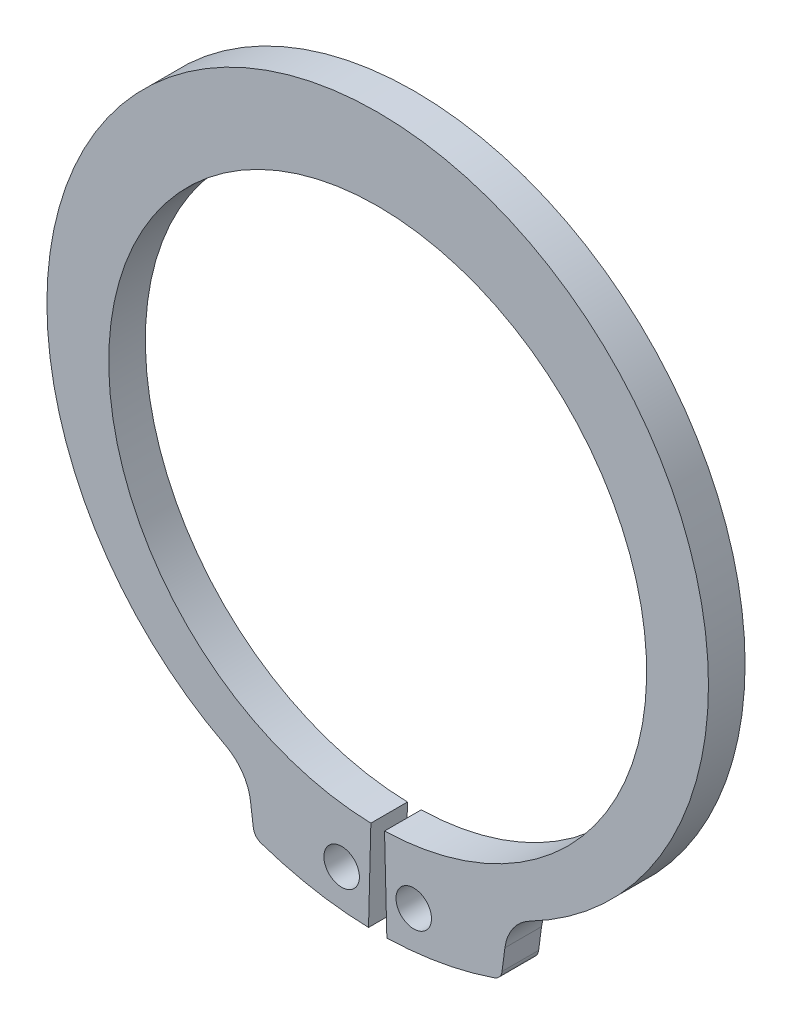
ISO-10303-21;
HEADER;
FILE_DESCRIPTION(('STEP AP214'),'2;1');
FILE_NAME('part.step','',(''),(''),'','','');
FILE_SCHEMA(('AUTOMOTIVE_DESIGN { 1 0 10303 214 1 1 1 1 }'));
ENDSEC;
DATA;
#1=APPLICATION_CONTEXT('core data for automotive mechanical design processes');
#2=APPLICATION_PROTOCOL_DEFINITION('international standard','automotive_design',2000,#1);
#3=PRODUCT_CONTEXT('',#1,'mechanical');
#4=PRODUCT('Part','Part','',(#3));
#5=PRODUCT_RELATED_PRODUCT_CATEGORY('part','',(#4));
#6=PRODUCT_DEFINITION_FORMATION('','',#4);
#7=PRODUCT_DEFINITION_CONTEXT('part definition',#1,'design');
#8=PRODUCT_DEFINITION('design','',#6,#7);
#9=PRODUCT_DEFINITION_SHAPE('','',#8);
#10=(LENGTH_UNIT() NAMED_UNIT(*) SI_UNIT(.MILLI.,.METRE.));
#11=(NAMED_UNIT(*) PLANE_ANGLE_UNIT() SI_UNIT($,.RADIAN.));
#12=(NAMED_UNIT(*) SI_UNIT($,.STERADIAN.) SOLID_ANGLE_UNIT());
#13=UNCERTAINTY_MEASURE_WITH_UNIT(LENGTH_MEASURE(1.E-05),#10,'distance_accuracy_value','');
#14=(GEOMETRIC_REPRESENTATION_CONTEXT(3) GLOBAL_UNCERTAINTY_ASSIGNED_CONTEXT((#13)) GLOBAL_UNIT_ASSIGNED_CONTEXT((#10,
#11,#12)) REPRESENTATION_CONTEXT('',''));
#15=CARTESIAN_POINT('',(0.,0.,0.));
#16=DIRECTION('',(0.,0.,1.));
#17=DIRECTION('',(1.,0.,0.));
#18=AXIS2_PLACEMENT_3D('',#15,#16,#17);
#19=CARTESIAN_POINT('',(0.,0.,-3.2));
#20=DIRECTION('',(0.,0.,1.));
#21=DIRECTION('',(1.,0.,0.));
#22=AXIS2_PLACEMENT_3D('',#19,#20,#21);
#23=CYLINDRICAL_SURFACE('',#22,23.5);
#24=CARTESIAN_POINT('',(0.,0.,0.));
#25=DIRECTION('',(0.,0.,-1.));
#26=DIRECTION('',(1.,0.,0.));
#27=AXIS2_PLACEMENT_3D('',#24,#25,#26);
#28=CIRCLE('',#27,23.5);
#29=CARTESIAN_POINT('',(-0.596825396825397,-23.4924200423393,0.));
#30=VERTEX_POINT('',#29);
#31=CARTESIAN_POINT('',(0.596825396825397,-23.4924200423393,0.));
#32=VERTEX_POINT('',#31);
#33=EDGE_CURVE('E155',#30,#32,#28,.T.);
#34=ORIENTED_EDGE('',*,*,#33,.F.);
#35=DIRECTION('',(0.,0.,1.));
#36=VECTOR('',#35,1.);
#37=CARTESIAN_POINT('',(-0.596825396825397,-23.4924200423393,-3.2));
#38=LINE('',#37,#36);
#39=CARTESIAN_POINT('',(-0.596825396825397,-23.4924200423393,-3.2));
#40=VERTEX_POINT('',#39);
#41=EDGE_CURVE('E11',#40,#30,#38,.T.);
#42=ORIENTED_EDGE('',*,*,#41,.F.);
#43=CARTESIAN_POINT('',(0.,0.,-3.2));
#44=DIRECTION('',(0.,0.,-1.));
#45=DIRECTION('',(1.,0.,0.));
#46=AXIS2_PLACEMENT_3D('',#43,#44,#45);
#47=CIRCLE('',#46,23.5);
#48=CARTESIAN_POINT('',(0.596825396825397,-23.4924200423393,-3.2));
#49=VERTEX_POINT('',#48);
#50=EDGE_CURVE('E188',#40,#49,#47,.T.);
#51=ORIENTED_EDGE('',*,*,#50,.T.);
#52=DIRECTION('',(0.,0.,1.));
#53=VECTOR('',#52,1.);
#54=CARTESIAN_POINT('',(0.596825396825397,-23.4924200423393,-3.2));
#55=LINE('',#54,#53);
#56=EDGE_CURVE('E37',#49,#32,#55,.T.);
#57=ORIENTED_EDGE('',*,*,#56,.T.);
#58=EDGE_LOOP('',(#34,#42,#51,#57));
#59=FACE_BOUND('',#58,.T.);
#60=ADVANCED_FACE('F34',(#59),#23,.F.);
#61=CARTESIAN_POINT('',(-0.596825396825397,-23.4924200423393,-3.2));
#62=DIRECTION('',(0.999677448610182,-0.0253968253968254,0.));
#63=DIRECTION('',(0.0253968253968254,0.999677448610182,0.));
#64=AXIS2_PLACEMENT_3D('',#61,#62,#63);
#65=PLANE('',#64);
#66=DIRECTION('',(0.0253968253968254,0.999677448610182,0.));
#67=VECTOR('',#66,1.);
#68=CARTESIAN_POINT('',(-0.596825396825397,-23.4924200423393,0.));
#69=LINE('',#68,#67);
#70=CARTESIAN_POINT('',(-0.8,-31.4898396312207,0.));
#71=VERTEX_POINT('',#70);
#72=EDGE_CURVE('E186',#71,#30,#69,.T.);
#73=ORIENTED_EDGE('',*,*,#72,.F.);
#74=DIRECTION('',(0.,0.,1.));
#75=VECTOR('',#74,1.);
#76=CARTESIAN_POINT('',(-0.8,-31.4898396312207,-3.2));
#77=LINE('',#76,#75);
#78=CARTESIAN_POINT('',(-0.8,-31.4898396312207,-3.2));
#79=VERTEX_POINT('',#78);
#80=EDGE_CURVE('E43',#79,#71,#77,.T.);
#81=ORIENTED_EDGE('',*,*,#80,.F.);
#82=DIRECTION('',(0.0253968253968254,0.999677448610182,0.));
#83=VECTOR('',#82,1.);
#84=CARTESIAN_POINT('',(-0.596825396825397,-23.4924200423393,-3.2));
#85=LINE('',#84,#83);
#86=EDGE_CURVE('E145',#79,#40,#85,.T.);
#87=ORIENTED_EDGE('',*,*,#86,.T.);
#88=ORIENTED_EDGE('',*,*,#41,.T.);
#89=EDGE_LOOP('',(#73,#81,#87,#88));
#90=FACE_BOUND('',#89,.T.);
#91=ADVANCED_FACE('F208',(#90),#65,.T.);
#92=CARTESIAN_POINT('',(0.,0.,-3.2));
#93=DIRECTION('',(0.,0.,1.));
#94=DIRECTION('',(1.,0.,0.));
#95=AXIS2_PLACEMENT_3D('',#92,#93,#94);
#96=CYLINDRICAL_SURFACE('',#95,31.5);
#97=CARTESIAN_POINT('',(0.,0.,0.));
#98=DIRECTION('',(0.,0.,1.));
#99=DIRECTION('',(1.,0.,0.));
#100=AXIS2_PLACEMENT_3D('',#97,#98,#99);
#101=CIRCLE('',#100,31.5);
#102=CARTESIAN_POINT('',(-10.1952854062747,-29.8044653614958,0.));
#103=VERTEX_POINT('',#102);
#104=EDGE_CURVE('E132',#103,#71,#101,.T.);
#105=ORIENTED_EDGE('',*,*,#104,.F.);
#106=DIRECTION('',(0.,0.,1.));
#107=VECTOR('',#106,1.);
#108=CARTESIAN_POINT('',(-10.1952854062747,-29.8044653614958,-3.2));
#109=LINE('',#108,#107);
#110=CARTESIAN_POINT('',(-10.1952854062747,-29.8044653614958,-3.2));
#111=VERTEX_POINT('',#110);
#112=EDGE_CURVE('E127',#111,#103,#109,.T.);
#113=ORIENTED_EDGE('',*,*,#112,.F.);
#114=CARTESIAN_POINT('',(0.,0.,-3.2));
#115=DIRECTION('',(0.,0.,1.));
#116=DIRECTION('',(1.,0.,0.));
#117=AXIS2_PLACEMENT_3D('',#114,#115,#116);
#118=CIRCLE('',#117,31.5);
#119=EDGE_CURVE('E130',#111,#79,#118,.T.);
#120=ORIENTED_EDGE('',*,*,#119,.T.);
#121=ORIENTED_EDGE('',*,*,#80,.T.);
#122=EDGE_LOOP('',(#105,#113,#120,#121));
#123=FACE_BOUND('',#122,.T.);
#124=ADVANCED_FACE('F129',(#123),#96,.T.);
#125=CARTESIAN_POINT('',(-9.87162555210725,-28.8582918579562,-3.2));
#126=DIRECTION('',(0.,0.,1.));
#127=DIRECTION('',(1.,0.,0.));
#128=AXIS2_PLACEMENT_3D('',#125,#126,#127);
#129=CYLINDRICAL_SURFACE('',#128,1.);
#130=CARTESIAN_POINT('',(-9.87162555210725,-28.8582918579562,0.));
#131=DIRECTION('',(0.,0.,1.));
#132=DIRECTION('',(1.,0.,0.));
#133=AXIS2_PLACEMENT_3D('',#130,#131,#132);
#134=CIRCLE('',#133,1.);
#135=CARTESIAN_POINT('',(-10.8630704134811,-28.9888180501763,0.));
#136=VERTEX_POINT('',#135);
#137=EDGE_CURVE('E183',#136,#103,#134,.T.);
#138=ORIENTED_EDGE('',*,*,#137,.F.);
#139=DIRECTION('',(0.,0.,1.));
#140=VECTOR('',#139,1.);
#141=CARTESIAN_POINT('',(-10.8630704134811,-28.9888180501763,-3.2));
#142=LINE('',#141,#140);
#143=CARTESIAN_POINT('',(-10.8630704134811,-28.9888180501763,-3.2));
#144=VERTEX_POINT('',#143);
#145=EDGE_CURVE('E137',#144,#136,#142,.T.);
#146=ORIENTED_EDGE('',*,*,#145,.F.);
#147=CARTESIAN_POINT('',(-9.87162555210725,-28.8582918579562,-3.2));
#148=DIRECTION('',(0.,0.,1.));
#149=DIRECTION('',(1.,0.,0.));
#150=AXIS2_PLACEMENT_3D('',#147,#148,#149);
#151=CIRCLE('',#150,1.);
#152=EDGE_CURVE('E143',#144,#111,#151,.T.);
#153=ORIENTED_EDGE('',*,*,#152,.T.);
#154=ORIENTED_EDGE('',*,*,#112,.T.);
#155=EDGE_LOOP('',(#138,#146,#153,#154));
#156=FACE_BOUND('',#155,.T.);
#157=ADVANCED_FACE('F147',(#156),#129,.T.);
#158=CARTESIAN_POINT('',(-11.1161809349621,-27.0662527656628,-3.2));
#159=DIRECTION('',(-0.99144486137381,-0.130526192220056,0.));
#160=DIRECTION('',(0.130526192220056,-0.99144486137381,0.));
#161=AXIS2_PLACEMENT_3D('',#158,#159,#160);
#162=PLANE('',#161);
#163=DIRECTION('',(0.130526192220056,-0.99144486137381,0.));
#164=VECTOR('',#163,1.);
#165=CARTESIAN_POINT('',(-11.1161809349621,-27.0662527656628,0.));
#166=LINE('',#165,#164);
#167=CARTESIAN_POINT('',(-11.1161809349621,-27.0662527656628,0.));
#168=VERTEX_POINT('',#167);
#169=EDGE_CURVE('E180',#168,#136,#166,.T.);
#170=ORIENTED_EDGE('',*,*,#169,.F.);
#171=DIRECTION('',(0.,0.,1.));
#172=VECTOR('',#171,1.);
#173=CARTESIAN_POINT('',(-11.1161809349621,-27.0662527656628,-3.2));
#174=LINE('',#173,#172);
#175=CARTESIAN_POINT('',(-11.1161809349621,-27.0662527656628,-3.2));
#176=VERTEX_POINT('',#175);
#177=EDGE_CURVE('E192',#176,#168,#174,.T.);
#178=ORIENTED_EDGE('',*,*,#177,.F.);
#179=DIRECTION('',(0.130526192220056,-0.99144486137381,0.));
#180=VECTOR('',#179,1.);
#181=CARTESIAN_POINT('',(-11.1161809349621,-27.0662527656628,-3.2));
#182=LINE('',#181,#180);
#183=EDGE_CURVE('E148',#176,#144,#182,.T.);
#184=ORIENTED_EDGE('',*,*,#183,.T.);
#185=ORIENTED_EDGE('',*,*,#145,.T.);
#186=EDGE_LOOP('',(#170,#178,#184,#185));
#187=FACE_BOUND('',#186,.T.);
#188=ADVANCED_FACE('F221',(#187),#162,.T.);
#189=CARTESIAN_POINT('',(-15.17967542697,-27.6012219644682,-3.2));
#190=DIRECTION('',(0.,0.,1.));
#191=DIRECTION('',(1.,0.,0.));
#192=AXIS2_PLACEMENT_3D('',#189,#190,#191);
#193=CYLINDRICAL_SURFACE('',#192,4.09855822579712);
#194=CARTESIAN_POINT('',(-15.17967542697,-27.6012219644682,0.));
#195=DIRECTION('',(0.,0.,-1.));
#196=DIRECTION('',(1.,0.,0.));
#197=AXIS2_PLACEMENT_3D('',#194,#195,#196);
#198=CIRCLE('',#197,4.09855822579712);
#199=CARTESIAN_POINT('',(-13.2943329490197,-23.962037540578,0.));
#200=VERTEX_POINT('',#199);
#201=EDGE_CURVE('E177',#200,#168,#198,.T.);
#202=ORIENTED_EDGE('',*,*,#201,.F.);
#203=DIRECTION('',(0.,0.,1.));
#204=VECTOR('',#203,1.);
#205=CARTESIAN_POINT('',(-13.2943329490197,-23.962037540578,-3.2));
#206=LINE('',#205,#204);
#207=CARTESIAN_POINT('',(-13.2943329490197,-23.962037540578,-3.2));
#208=VERTEX_POINT('',#207);
#209=EDGE_CURVE('E194',#208,#200,#206,.T.);
#210=ORIENTED_EDGE('',*,*,#209,.F.);
#211=CARTESIAN_POINT('',(-15.17967542697,-27.6012219644682,-3.2));
#212=DIRECTION('',(0.,0.,-1.));
#213=DIRECTION('',(1.,0.,0.));
#214=AXIS2_PLACEMENT_3D('',#211,#212,#213);
#215=CIRCLE('',#214,4.09855822579712);
#216=EDGE_CURVE('E150',#208,#176,#215,.T.);
#217=ORIENTED_EDGE('',*,*,#216,.T.);
#218=ORIENTED_EDGE('',*,*,#177,.T.);
#219=EDGE_LOOP('',(#202,#210,#217,#218));
#220=FACE_BOUND('',#219,.T.);
#221=ADVANCED_FACE('F224',(#220),#193,.F.);
#222=CARTESIAN_POINT('',(0.,1.69936348332509,-3.2));
#223=DIRECTION('',(0.,0.,1.));
#224=DIRECTION('',(1.,0.,0.));
#225=AXIS2_PLACEMENT_3D('',#222,#223,#224);
#226=CYLINDRICAL_SURFACE('',#225,28.9006365166749);
#227=CARTESIAN_POINT('',(0.,1.69936348332509,0.));
#228=DIRECTION('',(0.,0.,1.));
#229=DIRECTION('',(1.,0.,0.));
#230=AXIS2_PLACEMENT_3D('',#227,#228,#229);
#231=CIRCLE('',#230,28.9006365166749);
#232=CARTESIAN_POINT('',(13.2943329490196,-23.962037540578,0.));
#233=VERTEX_POINT('',#232);
#234=EDGE_CURVE('E174',#233,#200,#231,.T.);
#235=ORIENTED_EDGE('',*,*,#234,.F.);
#236=DIRECTION('',(0.,0.,1.));
#237=VECTOR('',#236,1.);
#238=CARTESIAN_POINT('',(13.2943329490196,-23.962037540578,-3.2));
#239=LINE('',#238,#237);
#240=CARTESIAN_POINT('',(13.2943329490196,-23.962037540578,-3.2));
#241=VERTEX_POINT('',#240);
#242=EDGE_CURVE('E196',#241,#233,#239,.T.);
#243=ORIENTED_EDGE('',*,*,#242,.F.);
#244=CARTESIAN_POINT('',(0.,1.69936348332509,-3.2));
#245=DIRECTION('',(0.,0.,1.));
#246=DIRECTION('',(1.,0.,0.));
#247=AXIS2_PLACEMENT_3D('',#244,#245,#246);
#248=CIRCLE('',#247,28.9006365166749);
#249=EDGE_CURVE('E298',#241,#208,#248,.T.);
#250=ORIENTED_EDGE('',*,*,#249,.T.);
#251=ORIENTED_EDGE('',*,*,#209,.T.);
#252=EDGE_LOOP('',(#235,#243,#250,#251));
#253=FACE_BOUND('',#252,.T.);
#254=ADVANCED_FACE('F228',(#253),#226,.T.);
#255=CARTESIAN_POINT('',(15.17967542697,-27.6012219644682,-3.2));
#256=DIRECTION('',(0.,0.,1.));
#257=DIRECTION('',(1.,0.,0.));
#258=AXIS2_PLACEMENT_3D('',#255,#256,#257);
#259=CYLINDRICAL_SURFACE('',#258,4.09855822579712);
#260=CARTESIAN_POINT('',(15.17967542697,-27.6012219644682,0.));
#261=DIRECTION('',(0.,0.,-1.));
#262=DIRECTION('',(1.,0.,0.));
#263=AXIS2_PLACEMENT_3D('',#260,#261,#262);
#264=CIRCLE('',#263,4.09855822579712);
#265=CARTESIAN_POINT('',(11.1161809349621,-27.0662527656628,0.));
#266=VERTEX_POINT('',#265);
#267=EDGE_CURVE('E171',#266,#233,#264,.T.);
#268=ORIENTED_EDGE('',*,*,#267,.F.);
#269=DIRECTION('',(0.,0.,1.));
#270=VECTOR('',#269,1.);
#271=CARTESIAN_POINT('',(11.1161809349621,-27.0662527656628,-3.2));
#272=LINE('',#271,#270);
#273=CARTESIAN_POINT('',(11.1161809349621,-27.0662527656628,-3.2));
#274=VERTEX_POINT('',#273);
#275=EDGE_CURVE('E198',#274,#266,#272,.T.);
#276=ORIENTED_EDGE('',*,*,#275,.F.);
#277=CARTESIAN_POINT('',(15.17967542697,-27.6012219644682,-3.2));
#278=DIRECTION('',(0.,0.,-1.));
#279=DIRECTION('',(1.,0.,0.));
#280=AXIS2_PLACEMENT_3D('',#277,#278,#279);
#281=CIRCLE('',#280,4.09855822579712);
#282=EDGE_CURVE('E295',#274,#241,#281,.T.);
#283=ORIENTED_EDGE('',*,*,#282,.T.);
#284=ORIENTED_EDGE('',*,*,#242,.T.);
#285=EDGE_LOOP('',(#268,#276,#283,#284));
#286=FACE_BOUND('',#285,.T.);
#287=ADVANCED_FACE('F232',(#286),#259,.F.);
#288=CARTESIAN_POINT('',(11.1161809349621,-27.0662527656628,-3.2));
#289=DIRECTION('',(0.99144486137381,-0.130526192220055,0.));
#290=DIRECTION('',(0.130526192220055,0.99144486137381,0.));
#291=AXIS2_PLACEMENT_3D('',#288,#289,#290);
#292=PLANE('',#291);
#293=DIRECTION('',(0.130526192220055,0.99144486137381,0.));
#294=VECTOR('',#293,1.);
#295=CARTESIAN_POINT('',(11.1161809349621,-27.0662527656628,0.));
#296=LINE('',#295,#294);
#297=CARTESIAN_POINT('',(10.8630704134811,-28.9888180501763,0.));
#298=VERTEX_POINT('',#297);
#299=EDGE_CURVE('E168',#298,#266,#296,.T.);
#300=ORIENTED_EDGE('',*,*,#299,.F.);
#301=DIRECTION('',(0.,0.,1.));
#302=VECTOR('',#301,1.);
#303=CARTESIAN_POINT('',(10.8630704134811,-28.9888180501763,-3.2));
#304=LINE('',#303,#302);
#305=CARTESIAN_POINT('',(10.8630704134811,-28.9888180501763,-3.2));
#306=VERTEX_POINT('',#305);
#307=EDGE_CURVE('E200',#306,#298,#304,.T.);
#308=ORIENTED_EDGE('',*,*,#307,.F.);
#309=DIRECTION('',(0.130526192220055,0.99144486137381,0.));
#310=VECTOR('',#309,1.);
#311=CARTESIAN_POINT('',(11.1161809349621,-27.0662527656628,-3.2));
#312=LINE('',#311,#310);
#313=EDGE_CURVE('E292',#306,#274,#312,.T.);
#314=ORIENTED_EDGE('',*,*,#313,.T.);
#315=ORIENTED_EDGE('',*,*,#275,.T.);
#316=EDGE_LOOP('',(#300,#308,#314,#315));
#317=FACE_BOUND('',#316,.T.);
#318=ADVANCED_FACE('F236',(#317),#292,.T.);
#319=CARTESIAN_POINT('',(9.87162555210725,-28.8582918579562,-3.2));
#320=DIRECTION('',(0.,0.,1.));
#321=DIRECTION('',(1.,0.,0.));
#322=AXIS2_PLACEMENT_3D('',#319,#320,#321);
#323=CYLINDRICAL_SURFACE('',#322,1.);
#324=CARTESIAN_POINT('',(9.87162555210725,-28.8582918579562,0.));
#325=DIRECTION('',(0.,0.,1.));
#326=DIRECTION('',(-1.,0.,0.));
#327=AXIS2_PLACEMENT_3D('',#324,#325,#326);
#328=CIRCLE('',#327,1.);
#329=CARTESIAN_POINT('',(10.1952854062747,-29.8044653614958,0.));
#330=VERTEX_POINT('',#329);
#331=EDGE_CURVE('E165',#330,#298,#328,.T.);
#332=ORIENTED_EDGE('',*,*,#331,.F.);
#333=DIRECTION('',(0.,0.,1.));
#334=VECTOR('',#333,1.);
#335=CARTESIAN_POINT('',(10.1952854062747,-29.8044653614958,-3.2));
#336=LINE('',#335,#334);
#337=CARTESIAN_POINT('',(10.1952854062747,-29.8044653614958,-3.2));
#338=VERTEX_POINT('',#337);
#339=EDGE_CURVE('E202',#338,#330,#336,.T.);
#340=ORIENTED_EDGE('',*,*,#339,.F.);
#341=CARTESIAN_POINT('',(9.87162555210725,-28.8582918579562,-3.2));
#342=DIRECTION('',(0.,0.,1.));
#343=DIRECTION('',(-1.,0.,0.));
#344=AXIS2_PLACEMENT_3D('',#341,#342,#343);
#345=CIRCLE('',#344,1.);
#346=EDGE_CURVE('E289',#338,#306,#345,.T.);
#347=ORIENTED_EDGE('',*,*,#346,.T.);
#348=ORIENTED_EDGE('',*,*,#307,.T.);
#349=EDGE_LOOP('',(#332,#340,#347,#348));
#350=FACE_BOUND('',#349,.T.);
#351=ADVANCED_FACE('F240',(#350),#323,.T.);
#352=CARTESIAN_POINT('',(0.,0.,-3.2));
#353=DIRECTION('',(0.,0.,1.));
#354=DIRECTION('',(1.,0.,0.));
#355=AXIS2_PLACEMENT_3D('',#352,#353,#354);
#356=CYLINDRICAL_SURFACE('',#355,31.5);
#357=CARTESIAN_POINT('',(0.,0.,0.));
#358=DIRECTION('',(0.,0.,1.));
#359=DIRECTION('',(1.,0.,0.));
#360=AXIS2_PLACEMENT_3D('',#357,#358,#359);
#361=CIRCLE('',#360,31.5);
#362=CARTESIAN_POINT('',(0.799999999999999,-31.4898396312207,0.));
#363=VERTEX_POINT('',#362);
#364=EDGE_CURVE('E162',#363,#330,#361,.T.);
#365=ORIENTED_EDGE('',*,*,#364,.F.);
#366=DIRECTION('',(0.,0.,1.));
#367=VECTOR('',#366,1.);
#368=CARTESIAN_POINT('',(0.799999999999999,-31.4898396312207,-3.2));
#369=LINE('',#368,#367);
#370=CARTESIAN_POINT('',(0.799999999999999,-31.4898396312207,-3.2));
#371=VERTEX_POINT('',#370);
#372=EDGE_CURVE('E203',#371,#363,#369,.T.);
#373=ORIENTED_EDGE('',*,*,#372,.F.);
#374=CARTESIAN_POINT('',(0.,0.,-3.2));
#375=DIRECTION('',(0.,0.,1.));
#376=DIRECTION('',(1.,0.,0.));
#377=AXIS2_PLACEMENT_3D('',#374,#375,#376);
#378=CIRCLE('',#377,31.5);
#379=EDGE_CURVE('E286',#371,#338,#378,.T.);
#380=ORIENTED_EDGE('',*,*,#379,.T.);
#381=ORIENTED_EDGE('',*,*,#339,.T.);
#382=EDGE_LOOP('',(#365,#373,#380,#381));
#383=FACE_BOUND('',#382,.T.);
#384=ADVANCED_FACE('F244',(#383),#356,.T.);
#385=CARTESIAN_POINT('',(0.596825396825397,-23.4924200423393,-3.2));
#386=DIRECTION('',(-0.999677448610182,-0.0253968253968254,0.));
#387=DIRECTION('',(0.0253968253968254,-0.999677448610182,0.));
#388=AXIS2_PLACEMENT_3D('',#385,#386,#387);
#389=PLANE('',#388);
#390=DIRECTION('',(0.0253968253968254,-0.999677448610182,0.));
#391=VECTOR('',#390,1.);
#392=CARTESIAN_POINT('',(0.596825396825397,-23.4924200423393,0.));
#393=LINE('',#392,#391);
#394=EDGE_CURVE('E158',#32,#363,#393,.T.);
#395=ORIENTED_EDGE('',*,*,#394,.F.);
#396=ORIENTED_EDGE('',*,*,#56,.F.);
#397=DIRECTION('',(0.0253968253968254,-0.999677448610182,0.));
#398=VECTOR('',#397,1.);
#399=CARTESIAN_POINT('',(0.596825396825397,-23.4924200423393,-3.2));
#400=LINE('',#399,#398);
#401=EDGE_CURVE('E284',#49,#371,#400,.T.);
#402=ORIENTED_EDGE('',*,*,#401,.T.);
#403=ORIENTED_EDGE('',*,*,#372,.T.);
#404=EDGE_LOOP('',(#395,#396,#402,#403));
#405=FACE_BOUND('',#404,.T.);
#406=ADVANCED_FACE('F205',(#405),#389,.T.);
#407=CARTESIAN_POINT('',(0.,0.,-3.2));
#408=DIRECTION('',(0.,0.,1.));
#409=DIRECTION('',(1.,0.,0.));
#410=AXIS2_PLACEMENT_3D('',#407,#408,#409);
#411=PLANE('',#410);
#412=CARTESIAN_POINT('',(-3.15,-28.0738312312374,-3.2));
#413=DIRECTION('',(0.,0.,1.));
#414=DIRECTION('',(1.,0.,0.));
#415=AXIS2_PLACEMENT_3D('',#412,#413,#414);
#416=CIRCLE('',#415,1.55);
#417=CARTESIAN_POINT('',(-1.6,-28.0738312312374,-3.2));
#418=VERTEX_POINT('',#417);
#419=EDGE_CURVE('E271',#418,#418,#416,.T.);
#420=ORIENTED_EDGE('',*,*,#419,.T.);
#421=EDGE_LOOP('',(#420));
#422=FACE_BOUND('',#421,.T.);
#423=CARTESIAN_POINT('',(3.15,-28.0738312312374,-3.2));
#424=DIRECTION('',(0.,0.,1.));
#425=DIRECTION('',(1.,0.,0.));
#426=AXIS2_PLACEMENT_3D('',#423,#424,#425);
#427=CIRCLE('',#426,1.55);
#428=CARTESIAN_POINT('',(4.7,-28.0738312312374,-3.2));
#429=VERTEX_POINT('',#428);
#430=EDGE_CURVE('E159',#429,#429,#427,.T.);
#431=ORIENTED_EDGE('',*,*,#430,.T.);
#432=EDGE_LOOP('',(#431));
#433=FACE_BOUND('',#432,.T.);
#434=ORIENTED_EDGE('',*,*,#50,.F.);
#435=ORIENTED_EDGE('',*,*,#86,.F.);
#436=ORIENTED_EDGE('',*,*,#119,.F.);
#437=ORIENTED_EDGE('',*,*,#152,.F.);
#438=ORIENTED_EDGE('',*,*,#183,.F.);
#439=ORIENTED_EDGE('',*,*,#216,.F.);
#440=ORIENTED_EDGE('',*,*,#249,.F.);
#441=ORIENTED_EDGE('',*,*,#282,.F.);
#442=ORIENTED_EDGE('',*,*,#313,.F.);
#443=ORIENTED_EDGE('',*,*,#346,.F.);
#444=ORIENTED_EDGE('',*,*,#379,.F.);
#445=ORIENTED_EDGE('',*,*,#401,.F.);
#446=EDGE_LOOP('',(#434,#435,#436,#437,#438,#439,#440,#441,#442,#443,#444,#445));
#447=FACE_BOUND('',#446,.T.);
#448=ADVANCED_FACE('F141',(#422,#433,#447),#411,.F.);
#449=CARTESIAN_POINT('',(0.,0.,0.));
#450=DIRECTION('',(0.,0.,1.));
#451=DIRECTION('',(1.,0.,0.));
#452=AXIS2_PLACEMENT_3D('',#449,#450,#451);
#453=PLANE('',#452);
#454=CARTESIAN_POINT('',(-3.15,-28.0738312312374,0.));
#455=DIRECTION('',(0.,0.,1.));
#456=DIRECTION('',(1.,0.,0.));
#457=AXIS2_PLACEMENT_3D('',#454,#455,#456);
#458=CIRCLE('',#457,1.55);
#459=CARTESIAN_POINT('',(-1.6,-28.0738312312374,0.));
#460=VERTEX_POINT('',#459);
#461=EDGE_CURVE('E274',#460,#460,#458,.T.);
#462=ORIENTED_EDGE('',*,*,#461,.F.);
#463=EDGE_LOOP('',(#462));
#464=FACE_BOUND('',#463,.T.);
#465=CARTESIAN_POINT('',(3.15,-28.0738312312374,0.));
#466=DIRECTION('',(0.,0.,1.));
#467=DIRECTION('',(1.,0.,0.));
#468=AXIS2_PLACEMENT_3D('',#465,#466,#467);
#469=CIRCLE('',#468,1.55);
#470=CARTESIAN_POINT('',(4.7,-28.0738312312374,0.));
#471=VERTEX_POINT('',#470);
#472=EDGE_CURVE('E276',#471,#471,#469,.T.);
#473=ORIENTED_EDGE('',*,*,#472,.F.);
#474=EDGE_LOOP('',(#473));
#475=FACE_BOUND('',#474,.T.);
#476=ORIENTED_EDGE('',*,*,#33,.T.);
#477=ORIENTED_EDGE('',*,*,#394,.T.);
#478=ORIENTED_EDGE('',*,*,#364,.T.);
#479=ORIENTED_EDGE('',*,*,#331,.T.);
#480=ORIENTED_EDGE('',*,*,#299,.T.);
#481=ORIENTED_EDGE('',*,*,#267,.T.);
#482=ORIENTED_EDGE('',*,*,#234,.T.);
#483=ORIENTED_EDGE('',*,*,#201,.T.);
#484=ORIENTED_EDGE('',*,*,#169,.T.);
#485=ORIENTED_EDGE('',*,*,#137,.T.);
#486=ORIENTED_EDGE('',*,*,#104,.T.);
#487=ORIENTED_EDGE('',*,*,#72,.T.);
#488=EDGE_LOOP('',(#476,#477,#478,#479,#480,#481,#482,#483,#484,#485,#486,#487));
#489=FACE_BOUND('',#488,.T.);
#490=ADVANCED_FACE('F207',(#464,#475,#489),#453,.T.);
#491=CARTESIAN_POINT('',(3.15,-28.0738312312374,-3.2));
#492=DIRECTION('',(0.,0.,1.));
#493=DIRECTION('',(1.,0.,0.));
#494=AXIS2_PLACEMENT_3D('',#491,#492,#493);
#495=CYLINDRICAL_SURFACE('',#494,1.55);
#496=ORIENTED_EDGE('',*,*,#430,.F.);
#497=EDGE_LOOP('',(#496));
#498=FACE_BOUND('',#497,.T.);
#499=ORIENTED_EDGE('',*,*,#472,.T.);
#500=EDGE_LOOP('',(#499));
#501=FACE_BOUND('',#500,.T.);
#502=ADVANCED_FACE('F256',(#498,#501),#495,.F.);
#503=CARTESIAN_POINT('',(-3.15,-28.0738312312374,-3.2));
#504=DIRECTION('',(0.,0.,1.));
#505=DIRECTION('',(1.,0.,0.));
#506=AXIS2_PLACEMENT_3D('',#503,#504,#505);
#507=CYLINDRICAL_SURFACE('',#506,1.55);
#508=ORIENTED_EDGE('',*,*,#419,.F.);
#509=EDGE_LOOP('',(#508));
#510=FACE_BOUND('',#509,.T.);
#511=ORIENTED_EDGE('',*,*,#461,.T.);
#512=EDGE_LOOP('',(#511));
#513=FACE_BOUND('',#512,.T.);
#514=ADVANCED_FACE('F263',(#510,#513),#507,.F.);
#515=CLOSED_SHELL('',(#60,#91,#124,#157,#188,#221,#254,#287,#318,#351,#384,#406,#448,#490,#502,#514));
#516=MANIFOLD_SOLID_BREP('B2',#515);
#517=ADVANCED_BREP_SHAPE_REPRESENTATION('',(#18,#516),#14);
#518=SHAPE_DEFINITION_REPRESENTATION(#9,#517);
ENDSEC;
END-ISO-10303-21;
